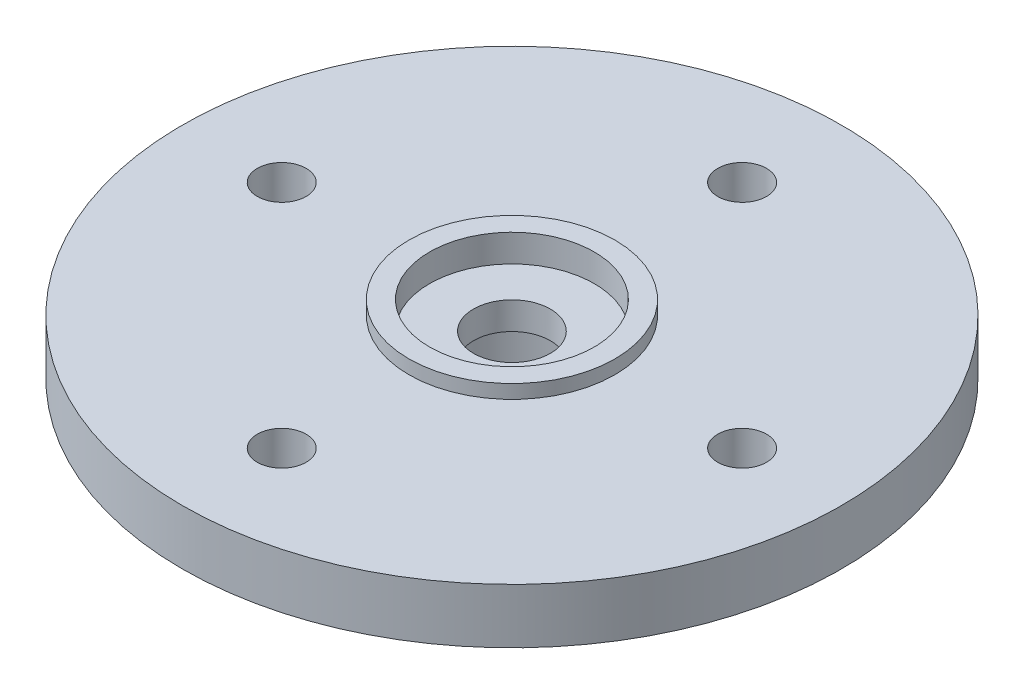
ISO-10303-21;
HEADER;
FILE_DESCRIPTION(('STEP AP214'),'2;1');
FILE_NAME('part.step','',(''),(''),'','','');
FILE_SCHEMA(('AUTOMOTIVE_DESIGN { 1 0 10303 214 1 1 1 1 }'));
ENDSEC;
DATA;
#1=APPLICATION_CONTEXT('core data for automotive mechanical design processes');
#2=APPLICATION_PROTOCOL_DEFINITION('international standard','automotive_design',2000,#1);
#3=PRODUCT_CONTEXT('',#1,'mechanical');
#4=PRODUCT('Part','Part','',(#3));
#5=PRODUCT_RELATED_PRODUCT_CATEGORY('part','',(#4));
#6=PRODUCT_DEFINITION_FORMATION('','',#4);
#7=PRODUCT_DEFINITION_CONTEXT('part definition',#1,'design');
#8=PRODUCT_DEFINITION('design','',#6,#7);
#9=PRODUCT_DEFINITION_SHAPE('','',#8);
#10=(LENGTH_UNIT() NAMED_UNIT(*) SI_UNIT(.MILLI.,.METRE.));
#11=(NAMED_UNIT(*) PLANE_ANGLE_UNIT() SI_UNIT($,.RADIAN.));
#12=(NAMED_UNIT(*) SI_UNIT($,.STERADIAN.) SOLID_ANGLE_UNIT());
#13=UNCERTAINTY_MEASURE_WITH_UNIT(LENGTH_MEASURE(1.E-05),#10,'distance_accuracy_value','');
#14=(GEOMETRIC_REPRESENTATION_CONTEXT(3) GLOBAL_UNCERTAINTY_ASSIGNED_CONTEXT((#13)) GLOBAL_UNIT_ASSIGNED_CONTEXT((#10,
#11,#12)) REPRESENTATION_CONTEXT('',''));
#15=CARTESIAN_POINT('',(0.,0.,0.));
#16=DIRECTION('',(0.,0.,1.));
#17=DIRECTION('',(1.,0.,0.));
#18=AXIS2_PLACEMENT_3D('',#15,#16,#17);
#19=CARTESIAN_POINT('',(0.,0.,0.));
#20=DIRECTION('',(0.,1.,0.));
#21=DIRECTION('',(0.,0.,1.));
#22=AXIS2_PLACEMENT_3D('',#19,#20,#21);
#23=CYLINDRICAL_SURFACE('',#22,1.4);
#24=CARTESIAN_POINT('',(0.,-0.5,0.));
#25=DIRECTION('',(0.,1.,0.));
#26=DIRECTION('',(0.,0.,1.));
#27=AXIS2_PLACEMENT_3D('',#24,#25,#26);
#28=CIRCLE('',#27,1.4);
#29=CARTESIAN_POINT('',(0.,-0.5,1.4));
#30=VERTEX_POINT('',#29);
#31=EDGE_CURVE('E52',#30,#30,#28,.T.);
#32=ORIENTED_EDGE('',*,*,#31,.T.);
#33=EDGE_LOOP('',(#32));
#34=FACE_BOUND('',#33,.T.);
#35=CARTESIAN_POINT('',(0.,-1.5,0.));
#36=DIRECTION('',(0.,-1.,0.));
#37=DIRECTION('',(0.,0.,-1.));
#38=AXIS2_PLACEMENT_3D('',#35,#36,#37);
#39=CIRCLE('',#38,1.4);
#40=CARTESIAN_POINT('',(0.,-1.5,-1.4));
#41=VERTEX_POINT('',#40);
#42=EDGE_CURVE('E40',#41,#41,#39,.T.);
#43=ORIENTED_EDGE('',*,*,#42,.T.);
#44=EDGE_LOOP('',(#43));
#45=FACE_BOUND('',#44,.T.);
#46=ADVANCED_FACE('F36',(#34,#45),#23,.F.);
#47=CARTESIAN_POINT('',(0.,0.,0.));
#48=DIRECTION('',(0.,1.,0.));
#49=DIRECTION('',(0.,0.,1.));
#50=AXIS2_PLACEMENT_3D('',#47,#48,#49);
#51=CYLINDRICAL_SURFACE('',#50,12.);
#52=CARTESIAN_POINT('',(0.,-2.,0.));
#53=DIRECTION('',(0.,1.,0.));
#54=DIRECTION('',(0.,0.,1.));
#55=AXIS2_PLACEMENT_3D('',#52,#53,#54);
#56=CIRCLE('',#55,12.);
#57=CARTESIAN_POINT('',(0.,-2.,12.));
#58=VERTEX_POINT('',#57);
#59=EDGE_CURVE('E10',#58,#58,#56,.T.);
#60=ORIENTED_EDGE('',*,*,#59,.T.);
#61=EDGE_LOOP('',(#60));
#62=FACE_BOUND('',#61,.T.);
#63=CARTESIAN_POINT('',(0.,0.,0.));
#64=DIRECTION('',(0.,1.,0.));
#65=DIRECTION('',(0.,0.,1.));
#66=AXIS2_PLACEMENT_3D('',#63,#64,#65);
#67=CIRCLE('',#66,12.);
#68=CARTESIAN_POINT('',(0.,0.,12.));
#69=VERTEX_POINT('',#68);
#70=EDGE_CURVE('E92',#69,#69,#67,.T.);
#71=ORIENTED_EDGE('',*,*,#70,.F.);
#72=EDGE_LOOP('',(#71));
#73=FACE_BOUND('',#72,.T.);
#74=ADVANCED_FACE('F38',(#62,#73),#51,.T.);
#75=CARTESIAN_POINT('',(-12.,-2.,0.));
#76=DIRECTION('',(0.,-1.,0.));
#77=DIRECTION('',(0.,0.,-1.));
#78=AXIS2_PLACEMENT_3D('',#75,#76,#77);
#79=PLANE('',#78);
#80=CARTESIAN_POINT('',(0.,-2.,-8.382));
#81=DIRECTION('',(0.,-1.,0.));
#82=DIRECTION('',(0.,0.,-1.));
#83=AXIS2_PLACEMENT_3D('',#80,#81,#82);
#84=CIRCLE('',#83,0.888999999999993);
#85=CARTESIAN_POINT('',(0.,-2.,-9.27099999999999));
#86=VERTEX_POINT('',#85);
#87=EDGE_CURVE('E59',#86,#86,#84,.T.);
#88=ORIENTED_EDGE('',*,*,#87,.F.);
#89=EDGE_LOOP('',(#88));
#90=FACE_BOUND('',#89,.T.);
#91=CARTESIAN_POINT('',(-8.382,-2.,0.));
#92=DIRECTION('',(0.,-1.,0.));
#93=DIRECTION('',(0.,0.,-1.));
#94=AXIS2_PLACEMENT_3D('',#91,#92,#93);
#95=CIRCLE('',#94,0.888999999999993);
#96=CARTESIAN_POINT('',(-8.382,-2.,-0.888999999999993));
#97=VERTEX_POINT('',#96);
#98=EDGE_CURVE('E77',#97,#97,#95,.T.);
#99=ORIENTED_EDGE('',*,*,#98,.F.);
#100=EDGE_LOOP('',(#99));
#101=FACE_BOUND('',#100,.T.);
#102=CARTESIAN_POINT('',(8.382,-2.,0.));
#103=DIRECTION('',(0.,-1.,0.));
#104=DIRECTION('',(0.,0.,-1.));
#105=AXIS2_PLACEMENT_3D('',#102,#103,#104);
#106=CIRCLE('',#105,0.888999999999993);
#107=CARTESIAN_POINT('',(8.382,-2.,-0.888999999999993));
#108=VERTEX_POINT('',#107);
#109=EDGE_CURVE('E83',#108,#108,#106,.T.);
#110=ORIENTED_EDGE('',*,*,#109,.F.);
#111=EDGE_LOOP('',(#110));
#112=FACE_BOUND('',#111,.T.);
#113=CARTESIAN_POINT('',(0.,-2.,8.382));
#114=DIRECTION('',(0.,-1.,0.));
#115=DIRECTION('',(0.,0.,-1.));
#116=AXIS2_PLACEMENT_3D('',#113,#114,#115);
#117=CIRCLE('',#116,0.888999999999993);
#118=CARTESIAN_POINT('',(0.,-2.,7.49300000000001));
#119=VERTEX_POINT('',#118);
#120=EDGE_CURVE('E89',#119,#119,#117,.T.);
#121=ORIENTED_EDGE('',*,*,#120,.F.);
#122=EDGE_LOOP('',(#121));
#123=FACE_BOUND('',#122,.T.);
#124=CARTESIAN_POINT('',(0.,-2.,0.));
#125=DIRECTION('',(0.,1.,0.));
#126=DIRECTION('',(0.,0.,1.));
#127=AXIS2_PLACEMENT_3D('',#124,#125,#126);
#128=CIRCLE('',#127,4.5);
#129=CARTESIAN_POINT('',(0.,-2.,4.5));
#130=VERTEX_POINT('',#129);
#131=EDGE_CURVE('E44',#130,#130,#128,.T.);
#132=ORIENTED_EDGE('',*,*,#131,.T.);
#133=EDGE_LOOP('',(#132));
#134=FACE_BOUND('',#133,.T.);
#135=ORIENTED_EDGE('',*,*,#59,.F.);
#136=EDGE_LOOP('',(#135));
#137=FACE_BOUND('',#136,.T.);
#138=ADVANCED_FACE('F118',(#90,#101,#112,#123,#134,#137),#79,.T.);
#139=CARTESIAN_POINT('',(0.,0.,0.));
#140=DIRECTION('',(0.,1.,0.));
#141=DIRECTION('',(0.,0.,1.));
#142=AXIS2_PLACEMENT_3D('',#139,#140,#141);
#143=CYLINDRICAL_SURFACE('',#142,4.5);
#144=CARTESIAN_POINT('',(0.,-4.5,0.));
#145=DIRECTION('',(0.,1.,0.));
#146=DIRECTION('',(0.,0.,1.));
#147=AXIS2_PLACEMENT_3D('',#144,#145,#146);
#148=CIRCLE('',#147,4.5);
#149=CARTESIAN_POINT('',(0.,-4.5,4.5));
#150=VERTEX_POINT('',#149);
#151=EDGE_CURVE('E49',#150,#150,#148,.T.);
#152=ORIENTED_EDGE('',*,*,#151,.T.);
#153=EDGE_LOOP('',(#152));
#154=FACE_BOUND('',#153,.T.);
#155=ORIENTED_EDGE('',*,*,#131,.F.);
#156=EDGE_LOOP('',(#155));
#157=FACE_BOUND('',#156,.T.);
#158=ADVANCED_FACE('F103',(#154,#157),#143,.T.);
#159=CARTESIAN_POINT('',(-4.5,-4.5,0.));
#160=DIRECTION('',(0.,-1.,0.));
#161=DIRECTION('',(0.,0.,-1.));
#162=AXIS2_PLACEMENT_3D('',#159,#160,#161);
#163=PLANE('',#162);
#164=CARTESIAN_POINT('',(0.,-4.5,0.));
#165=DIRECTION('',(0.,-1.,0.));
#166=DIRECTION('',(0.,0.,-1.));
#167=AXIS2_PLACEMENT_3D('',#164,#165,#166);
#168=CIRCLE('',#167,3.);
#169=CARTESIAN_POINT('',(0.,-4.5,-3.));
#170=VERTEX_POINT('',#169);
#171=EDGE_CURVE('E69',#170,#170,#168,.T.);
#172=ORIENTED_EDGE('',*,*,#171,.F.);
#173=EDGE_LOOP('',(#172));
#174=FACE_BOUND('',#173,.T.);
#175=ORIENTED_EDGE('',*,*,#151,.F.);
#176=EDGE_LOOP('',(#175));
#177=FACE_BOUND('',#176,.T.);
#178=ADVANCED_FACE('F106',(#174,#177),#163,.T.);
#179=CARTESIAN_POINT('',(-3.75,0.5,0.));
#180=DIRECTION('',(0.,1.,0.));
#181=DIRECTION('',(0.,0.,1.));
#182=AXIS2_PLACEMENT_3D('',#179,#180,#181);
#183=PLANE('',#182);
#184=CARTESIAN_POINT('',(0.,0.5,0.));
#185=DIRECTION('',(0.,1.,0.));
#186=DIRECTION('',(0.,0.,1.));
#187=AXIS2_PLACEMENT_3D('',#184,#185,#186);
#188=CIRCLE('',#187,3.);
#189=CARTESIAN_POINT('',(0.,0.5,3.));
#190=VERTEX_POINT('',#189);
#191=EDGE_CURVE('E62',#190,#190,#188,.T.);
#192=ORIENTED_EDGE('',*,*,#191,.F.);
#193=EDGE_LOOP('',(#192));
#194=FACE_BOUND('',#193,.T.);
#195=CARTESIAN_POINT('',(0.,0.5,0.));
#196=DIRECTION('',(0.,1.,0.));
#197=DIRECTION('',(0.,0.,1.));
#198=AXIS2_PLACEMENT_3D('',#195,#196,#197);
#199=CIRCLE('',#198,3.75);
#200=CARTESIAN_POINT('',(0.,0.5,3.75));
#201=VERTEX_POINT('',#200);
#202=EDGE_CURVE('E98',#201,#201,#199,.T.);
#203=ORIENTED_EDGE('',*,*,#202,.T.);
#204=EDGE_LOOP('',(#203));
#205=FACE_BOUND('',#204,.T.);
#206=ADVANCED_FACE('F108',(#194,#205),#183,.T.);
#207=CARTESIAN_POINT('',(0.,0.,0.));
#208=DIRECTION('',(0.,1.,0.));
#209=DIRECTION('',(0.,0.,1.));
#210=AXIS2_PLACEMENT_3D('',#207,#208,#209);
#211=CYLINDRICAL_SURFACE('',#210,3.75);
#212=CARTESIAN_POINT('',(0.,0.,0.));
#213=DIRECTION('',(0.,1.,0.));
#214=DIRECTION('',(0.,0.,1.));
#215=AXIS2_PLACEMENT_3D('',#212,#213,#214);
#216=CIRCLE('',#215,3.75);
#217=CARTESIAN_POINT('',(0.,0.,3.75));
#218=VERTEX_POINT('',#217);
#219=EDGE_CURVE('E95',#218,#218,#216,.T.);
#220=ORIENTED_EDGE('',*,*,#219,.T.);
#221=EDGE_LOOP('',(#220));
#222=FACE_BOUND('',#221,.T.);
#223=ORIENTED_EDGE('',*,*,#202,.F.);
#224=EDGE_LOOP('',(#223));
#225=FACE_BOUND('',#224,.T.);
#226=ADVANCED_FACE('F115',(#222,#225),#211,.T.);
#227=CARTESIAN_POINT('',(-12.,0.,0.));
#228=DIRECTION('',(0.,1.,0.));
#229=DIRECTION('',(0.,0.,1.));
#230=AXIS2_PLACEMENT_3D('',#227,#228,#229);
#231=PLANE('',#230);
#232=CARTESIAN_POINT('',(0.,0.,-8.382));
#233=DIRECTION('',(0.,1.,0.));
#234=DIRECTION('',(0.,0.,1.));
#235=AXIS2_PLACEMENT_3D('',#232,#233,#234);
#236=CIRCLE('',#235,0.888999999999987);
#237=CARTESIAN_POINT('',(0.,0.,-7.49300000000001));
#238=VERTEX_POINT('',#237);
#239=EDGE_CURVE('E54',#238,#238,#236,.T.);
#240=ORIENTED_EDGE('',*,*,#239,.F.);
#241=EDGE_LOOP('',(#240));
#242=FACE_BOUND('',#241,.T.);
#243=CARTESIAN_POINT('',(-8.382,0.,0.));
#244=DIRECTION('',(0.,1.,0.));
#245=DIRECTION('',(0.,0.,1.));
#246=AXIS2_PLACEMENT_3D('',#243,#244,#245);
#247=CIRCLE('',#246,0.888999999999987);
#248=CARTESIAN_POINT('',(-8.382,0.,0.888999999999987));
#249=VERTEX_POINT('',#248);
#250=EDGE_CURVE('E74',#249,#249,#247,.T.);
#251=ORIENTED_EDGE('',*,*,#250,.F.);
#252=EDGE_LOOP('',(#251));
#253=FACE_BOUND('',#252,.T.);
#254=CARTESIAN_POINT('',(8.382,0.,0.));
#255=DIRECTION('',(0.,1.,0.));
#256=DIRECTION('',(0.,0.,1.));
#257=AXIS2_PLACEMENT_3D('',#254,#255,#256);
#258=CIRCLE('',#257,0.888999999999987);
#259=CARTESIAN_POINT('',(8.382,0.,0.888999999999987));
#260=VERTEX_POINT('',#259);
#261=EDGE_CURVE('E80',#260,#260,#258,.T.);
#262=ORIENTED_EDGE('',*,*,#261,.F.);
#263=EDGE_LOOP('',(#262));
#264=FACE_BOUND('',#263,.T.);
#265=CARTESIAN_POINT('',(0.,0.,8.382));
#266=DIRECTION('',(0.,1.,0.));
#267=DIRECTION('',(0.,0.,1.));
#268=AXIS2_PLACEMENT_3D('',#265,#266,#267);
#269=CIRCLE('',#268,0.888999999999987);
#270=CARTESIAN_POINT('',(0.,0.,9.27099999999999));
#271=VERTEX_POINT('',#270);
#272=EDGE_CURVE('E86',#271,#271,#269,.T.);
#273=ORIENTED_EDGE('',*,*,#272,.F.);
#274=EDGE_LOOP('',(#273));
#275=FACE_BOUND('',#274,.T.);
#276=ORIENTED_EDGE('',*,*,#70,.T.);
#277=EDGE_LOOP('',(#276));
#278=FACE_BOUND('',#277,.T.);
#279=ORIENTED_EDGE('',*,*,#219,.F.);
#280=EDGE_LOOP('',(#279));
#281=FACE_BOUND('',#280,.T.);
#282=ADVANCED_FACE('F130',(#242,#253,#264,#275,#278,#281),#231,.T.);
#283=CARTESIAN_POINT('',(0.,0.,8.382));
#284=DIRECTION('',(0.,1.,0.));
#285=DIRECTION('',(0.,0.,1.));
#286=AXIS2_PLACEMENT_3D('',#283,#284,#285);
#287=CYLINDRICAL_SURFACE('',#286,0.888999999999993);
#288=ORIENTED_EDGE('',*,*,#272,.T.);
#289=EDGE_LOOP('',(#288));
#290=FACE_BOUND('',#289,.T.);
#291=ORIENTED_EDGE('',*,*,#120,.T.);
#292=EDGE_LOOP('',(#291));
#293=FACE_BOUND('',#292,.T.);
#294=ADVANCED_FACE('F134',(#290,#293),#287,.F.);
#295=CARTESIAN_POINT('',(8.382,0.,0.));
#296=DIRECTION('',(0.,1.,0.));
#297=DIRECTION('',(0.,0.,1.));
#298=AXIS2_PLACEMENT_3D('',#295,#296,#297);
#299=CYLINDRICAL_SURFACE('',#298,0.888999999999993);
#300=ORIENTED_EDGE('',*,*,#261,.T.);
#301=EDGE_LOOP('',(#300));
#302=FACE_BOUND('',#301,.T.);
#303=ORIENTED_EDGE('',*,*,#109,.T.);
#304=EDGE_LOOP('',(#303));
#305=FACE_BOUND('',#304,.T.);
#306=ADVANCED_FACE('F138',(#302,#305),#299,.F.);
#307=CARTESIAN_POINT('',(-8.382,0.,0.));
#308=DIRECTION('',(0.,1.,0.));
#309=DIRECTION('',(0.,0.,1.));
#310=AXIS2_PLACEMENT_3D('',#307,#308,#309);
#311=CYLINDRICAL_SURFACE('',#310,0.888999999999993);
#312=ORIENTED_EDGE('',*,*,#250,.T.);
#313=EDGE_LOOP('',(#312));
#314=FACE_BOUND('',#313,.T.);
#315=ORIENTED_EDGE('',*,*,#98,.T.);
#316=EDGE_LOOP('',(#315));
#317=FACE_BOUND('',#316,.T.);
#318=ADVANCED_FACE('F142',(#314,#317),#311,.F.);
#319=CARTESIAN_POINT('',(0.,0.,-8.382));
#320=DIRECTION('',(0.,1.,0.));
#321=DIRECTION('',(0.,0.,1.));
#322=AXIS2_PLACEMENT_3D('',#319,#320,#321);
#323=CYLINDRICAL_SURFACE('',#322,0.888999999999993);
#324=ORIENTED_EDGE('',*,*,#239,.T.);
#325=EDGE_LOOP('',(#324));
#326=FACE_BOUND('',#325,.T.);
#327=ORIENTED_EDGE('',*,*,#87,.T.);
#328=EDGE_LOOP('',(#327));
#329=FACE_BOUND('',#328,.T.);
#330=ADVANCED_FACE('F146',(#326,#329),#323,.F.);
#331=CARTESIAN_POINT('',(0.,-0.5,0.));
#332=DIRECTION('',(0.,1.,0.));
#333=DIRECTION('',(0.,0.,1.));
#334=AXIS2_PLACEMENT_3D('',#331,#332,#333);
#335=CYLINDRICAL_SURFACE('',#334,3.);
#336=CARTESIAN_POINT('',(0.,-0.5,0.));
#337=DIRECTION('',(0.,1.,0.));
#338=DIRECTION('',(0.,0.,1.));
#339=AXIS2_PLACEMENT_3D('',#336,#337,#338);
#340=CIRCLE('',#339,3.);
#341=CARTESIAN_POINT('',(0.,-0.5,3.));
#342=VERTEX_POINT('',#341);
#343=EDGE_CURVE('E55',#342,#342,#340,.T.);
#344=ORIENTED_EDGE('',*,*,#343,.F.);
#345=EDGE_LOOP('',(#344));
#346=FACE_BOUND('',#345,.T.);
#347=ORIENTED_EDGE('',*,*,#191,.T.);
#348=EDGE_LOOP('',(#347));
#349=FACE_BOUND('',#348,.T.);
#350=ADVANCED_FACE('F150',(#346,#349),#335,.F.);
#351=CARTESIAN_POINT('',(0.,-0.5,0.));
#352=DIRECTION('',(0.,1.,0.));
#353=DIRECTION('',(0.,0.,1.));
#354=AXIS2_PLACEMENT_3D('',#351,#352,#353);
#355=PLANE('',#354);
#356=ORIENTED_EDGE('',*,*,#31,.F.);
#357=EDGE_LOOP('',(#356));
#358=FACE_BOUND('',#357,.T.);
#359=ORIENTED_EDGE('',*,*,#343,.T.);
#360=EDGE_LOOP('',(#359));
#361=FACE_BOUND('',#360,.T.);
#362=ADVANCED_FACE('F154',(#358,#361),#355,.T.);
#363=CARTESIAN_POINT('',(0.,-1.5,0.));
#364=DIRECTION('',(0.,-1.,0.));
#365=DIRECTION('',(0.,0.,-1.));
#366=AXIS2_PLACEMENT_3D('',#363,#364,#365);
#367=CYLINDRICAL_SURFACE('',#366,3.);
#368=CARTESIAN_POINT('',(0.,-1.5,0.));
#369=DIRECTION('',(0.,-1.,0.));
#370=DIRECTION('',(0.,0.,-1.));
#371=AXIS2_PLACEMENT_3D('',#368,#369,#370);
#372=CIRCLE('',#371,3.);
#373=CARTESIAN_POINT('',(0.,-1.5,-3.));
#374=VERTEX_POINT('',#373);
#375=EDGE_CURVE('E173',#374,#374,#372,.T.);
#376=ORIENTED_EDGE('',*,*,#375,.F.);
#377=EDGE_LOOP('',(#376));
#378=FACE_BOUND('',#377,.T.);
#379=ORIENTED_EDGE('',*,*,#171,.T.);
#380=EDGE_LOOP('',(#379));
#381=FACE_BOUND('',#380,.T.);
#382=ADVANCED_FACE('F158',(#378,#381),#367,.F.);
#383=CARTESIAN_POINT('',(0.,-1.5,0.));
#384=DIRECTION('',(0.,-1.,0.));
#385=DIRECTION('',(0.,0.,-1.));
#386=AXIS2_PLACEMENT_3D('',#383,#384,#385);
#387=PLANE('',#386);
#388=ORIENTED_EDGE('',*,*,#42,.F.);
#389=EDGE_LOOP('',(#388));
#390=FACE_BOUND('',#389,.T.);
#391=ORIENTED_EDGE('',*,*,#375,.T.);
#392=EDGE_LOOP('',(#391));
#393=FACE_BOUND('',#392,.T.);
#394=ADVANCED_FACE('F162',(#390,#393),#387,.T.);
#395=CLOSED_SHELL('',(#46,#74,#138,#158,#178,#206,#226,#282,#294,#306,#318,#330,#350,#362,#382,#394));
#396=MANIFOLD_SOLID_BREP('B2',#395);
#397=ADVANCED_BREP_SHAPE_REPRESENTATION('',(#18,#396),#14);
#398=SHAPE_DEFINITION_REPRESENTATION(#9,#397);
ENDSEC;
END-ISO-10303-21;
